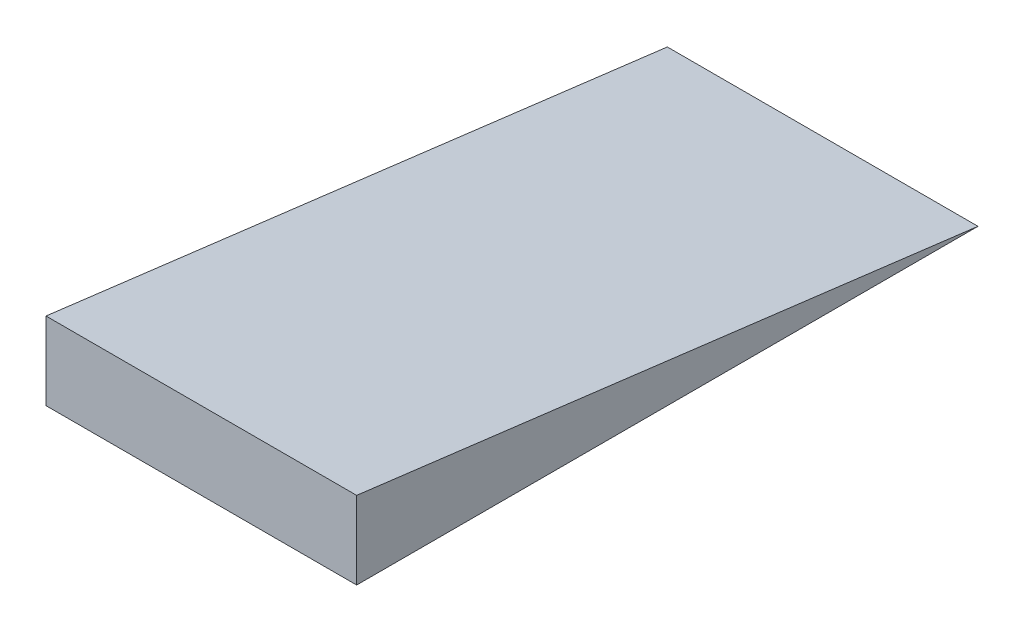
ISO-10303-21;
HEADER;
FILE_DESCRIPTION(('STEP AP214'),'2;1');
FILE_NAME('part.step','',(''),(''),'','','');
FILE_SCHEMA(('AUTOMOTIVE_DESIGN { 1 0 10303 214 1 1 1 1 }'));
ENDSEC;
DATA;
#1=APPLICATION_CONTEXT('core data for automotive mechanical design processes');
#2=APPLICATION_PROTOCOL_DEFINITION('international standard','automotive_design',2000,#1);
#3=PRODUCT_CONTEXT('',#1,'mechanical');
#4=PRODUCT('Part','Part','',(#3));
#5=PRODUCT_RELATED_PRODUCT_CATEGORY('part','',(#4));
#6=PRODUCT_DEFINITION_FORMATION('','',#4);
#7=PRODUCT_DEFINITION_CONTEXT('part definition',#1,'design');
#8=PRODUCT_DEFINITION('design','',#6,#7);
#9=PRODUCT_DEFINITION_SHAPE('','',#8);
#10=(LENGTH_UNIT() NAMED_UNIT(*) SI_UNIT(.MILLI.,.METRE.));
#11=(NAMED_UNIT(*) PLANE_ANGLE_UNIT() SI_UNIT($,.RADIAN.));
#12=(NAMED_UNIT(*) SI_UNIT($,.STERADIAN.) SOLID_ANGLE_UNIT());
#13=UNCERTAINTY_MEASURE_WITH_UNIT(LENGTH_MEASURE(1.E-05),#10,'distance_accuracy_value','');
#14=(GEOMETRIC_REPRESENTATION_CONTEXT(3) GLOBAL_UNCERTAINTY_ASSIGNED_CONTEXT((#13)) GLOBAL_UNIT_ASSIGNED_CONTEXT((#10,
#11,#12)) REPRESENTATION_CONTEXT('',''));
#15=CARTESIAN_POINT('',(0.,0.,0.));
#16=DIRECTION('',(0.,0.,1.));
#17=DIRECTION('',(1.,0.,0.));
#18=AXIS2_PLACEMENT_3D('',#15,#16,#17);
#19=CARTESIAN_POINT('',(800.,-100.,-1600.));
#20=DIRECTION('',(0.,-0.992277876713668,0.124034734589208));
#21=DIRECTION('',(0.,-0.124034734589208,-0.992277876713668));
#22=AXIS2_PLACEMENT_3D('',#19,#20,#21);
#23=PLANE('',#22);
#24=DIRECTION('',(0.,0.124034734589208,0.992277876713668));
#25=VECTOR('',#24,1.);
#26=CARTESIAN_POINT('',(0.,-100.,-1600.));
#27=LINE('',#26,#25);
#28=CARTESIAN_POINT('',(0.,-100.,-1600.));
#29=VERTEX_POINT('',#28);
#30=CARTESIAN_POINT('',(0.,100.,0.));
#31=VERTEX_POINT('',#30);
#32=EDGE_CURVE('E84',#29,#31,#27,.T.);
#33=ORIENTED_EDGE('',*,*,#32,.T.);
#34=DIRECTION('',(-1.,0.,0.));
#35=VECTOR('',#34,1.);
#36=CARTESIAN_POINT('',(800.,100.,0.));
#37=LINE('',#36,#35);
#38=CARTESIAN_POINT('',(800.,100.,0.));
#39=VERTEX_POINT('',#38);
#40=EDGE_CURVE('E11',#39,#31,#37,.T.);
#41=ORIENTED_EDGE('',*,*,#40,.F.);
#42=DIRECTION('',(0.,0.124034734589208,0.992277876713668));
#43=VECTOR('',#42,1.);
#44=CARTESIAN_POINT('',(800.,-100.,-1600.));
#45=LINE('',#44,#43);
#46=CARTESIAN_POINT('',(800.,-100.,-1600.));
#47=VERTEX_POINT('',#46);
#48=EDGE_CURVE('E77',#47,#39,#45,.T.);
#49=ORIENTED_EDGE('',*,*,#48,.F.);
#50=DIRECTION('',(-1.,0.,0.));
#51=VECTOR('',#50,1.);
#52=CARTESIAN_POINT('',(800.,-100.,-1600.));
#53=LINE('',#52,#51);
#54=EDGE_CURVE('E85',#47,#29,#53,.T.);
#55=ORIENTED_EDGE('',*,*,#54,.T.);
#56=EDGE_LOOP('',(#33,#41,#49,#55));
#57=FACE_BOUND('',#56,.T.);
#58=ADVANCED_FACE('F37',(#57),#23,.F.);
#59=CARTESIAN_POINT('',(800.,100.,0.));
#60=DIRECTION('',(0.,0.,-1.));
#61=DIRECTION('',(-1.,0.,0.));
#62=AXIS2_PLACEMENT_3D('',#59,#60,#61);
#63=PLANE('',#62);
#64=DIRECTION('',(0.,-1.,0.));
#65=VECTOR('',#64,1.);
#66=CARTESIAN_POINT('',(0.,100.,0.));
#67=LINE('',#66,#65);
#68=CARTESIAN_POINT('',(0.,-100.,0.));
#69=VERTEX_POINT('',#68);
#70=EDGE_CURVE('E65',#31,#69,#67,.T.);
#71=ORIENTED_EDGE('',*,*,#70,.T.);
#72=DIRECTION('',(-1.,0.,0.));
#73=VECTOR('',#72,1.);
#74=CARTESIAN_POINT('',(800.,-100.,0.));
#75=LINE('',#74,#73);
#76=CARTESIAN_POINT('',(800.,-100.,0.));
#77=VERTEX_POINT('',#76);
#78=EDGE_CURVE('E45',#77,#69,#75,.T.);
#79=ORIENTED_EDGE('',*,*,#78,.F.);
#80=DIRECTION('',(0.,-1.,0.));
#81=VECTOR('',#80,1.);
#82=CARTESIAN_POINT('',(800.,100.,0.));
#83=LINE('',#82,#81);
#84=EDGE_CURVE('E73',#39,#77,#83,.T.);
#85=ORIENTED_EDGE('',*,*,#84,.F.);
#86=ORIENTED_EDGE('',*,*,#40,.T.);
#87=EDGE_LOOP('',(#71,#79,#85,#86));
#88=FACE_BOUND('',#87,.T.);
#89=ADVANCED_FACE('F74',(#88),#63,.F.);
#90=CARTESIAN_POINT('',(800.,-100.,0.));
#91=DIRECTION('',(0.,1.,0.));
#92=DIRECTION('',(0.,0.,1.));
#93=AXIS2_PLACEMENT_3D('',#90,#91,#92);
#94=PLANE('',#93);
#95=DIRECTION('',(0.,0.,-1.));
#96=VECTOR('',#95,1.);
#97=CARTESIAN_POINT('',(0.,-100.,0.));
#98=LINE('',#97,#96);
#99=EDGE_CURVE('E70',#69,#29,#98,.T.);
#100=ORIENTED_EDGE('',*,*,#99,.T.);
#101=ORIENTED_EDGE('',*,*,#54,.F.);
#102=DIRECTION('',(0.,0.,-1.));
#103=VECTOR('',#102,1.);
#104=CARTESIAN_POINT('',(800.,-100.,0.));
#105=LINE('',#104,#103);
#106=EDGE_CURVE('E53',#77,#47,#105,.T.);
#107=ORIENTED_EDGE('',*,*,#106,.F.);
#108=ORIENTED_EDGE('',*,*,#78,.T.);
#109=EDGE_LOOP('',(#100,#101,#107,#108));
#110=FACE_BOUND('',#109,.T.);
#111=ADVANCED_FACE('F92',(#110),#94,.F.);
#112=CARTESIAN_POINT('',(800.,0.,0.));
#113=DIRECTION('',(1.,0.,0.));
#114=DIRECTION('',(0.,0.,-1.));
#115=AXIS2_PLACEMENT_3D('',#112,#113,#114);
#116=PLANE('',#115);
#117=ORIENTED_EDGE('',*,*,#48,.T.);
#118=ORIENTED_EDGE('',*,*,#84,.T.);
#119=ORIENTED_EDGE('',*,*,#106,.T.);
#120=EDGE_LOOP('',(#117,#118,#119));
#121=FACE_BOUND('',#120,.T.);
#122=ADVANCED_FACE('F80',(#121),#116,.T.);
#123=CARTESIAN_POINT('',(0.,0.,0.));
#124=DIRECTION('',(1.,0.,0.));
#125=DIRECTION('',(0.,0.,-1.));
#126=AXIS2_PLACEMENT_3D('',#123,#124,#125);
#127=PLANE('',#126);
#128=ORIENTED_EDGE('',*,*,#32,.F.);
#129=ORIENTED_EDGE('',*,*,#99,.F.);
#130=ORIENTED_EDGE('',*,*,#70,.F.);
#131=EDGE_LOOP('',(#128,#129,#130));
#132=FACE_BOUND('',#131,.T.);
#133=ADVANCED_FACE('F93',(#132),#127,.F.);
#134=CLOSED_SHELL('',(#58,#89,#111,#122,#133));
#135=MANIFOLD_SOLID_BREP('B2',#134);
#136=ADVANCED_BREP_SHAPE_REPRESENTATION('',(#18,#135),#14);
#137=SHAPE_DEFINITION_REPRESENTATION(#9,#136);
ENDSEC;
END-ISO-10303-21;
